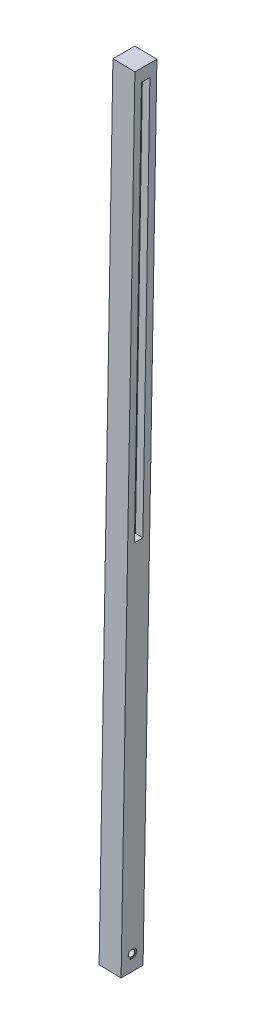
ISO-10303-21;
HEADER;
FILE_DESCRIPTION(('STEP AP214'),'2;1');
FILE_NAME('part.step','',(''),(''),'','','');
FILE_SCHEMA(('AUTOMOTIVE_DESIGN { 1 0 10303 214 1 1 1 1 }'));
ENDSEC;
DATA;
#1=APPLICATION_CONTEXT('core data for automotive mechanical design processes');
#2=APPLICATION_PROTOCOL_DEFINITION('international standard','automotive_design',2000,#1);
#3=PRODUCT_CONTEXT('',#1,'mechanical');
#4=PRODUCT('Part','Part','',(#3));
#5=PRODUCT_RELATED_PRODUCT_CATEGORY('part','',(#4));
#6=PRODUCT_DEFINITION_FORMATION('','',#4);
#7=PRODUCT_DEFINITION_CONTEXT('part definition',#1,'design');
#8=PRODUCT_DEFINITION('design','',#6,#7);
#9=PRODUCT_DEFINITION_SHAPE('','',#8);
#10=(LENGTH_UNIT() NAMED_UNIT(*) SI_UNIT(.MILLI.,.METRE.));
#11=(NAMED_UNIT(*) PLANE_ANGLE_UNIT() SI_UNIT($,.RADIAN.));
#12=(NAMED_UNIT(*) SI_UNIT($,.STERADIAN.) SOLID_ANGLE_UNIT());
#13=UNCERTAINTY_MEASURE_WITH_UNIT(LENGTH_MEASURE(1.E-05),#10,'distance_accuracy_value','');
#14=(GEOMETRIC_REPRESENTATION_CONTEXT(3) GLOBAL_UNCERTAINTY_ASSIGNED_CONTEXT((#13)) GLOBAL_UNIT_ASSIGNED_CONTEXT((#10,
#11,#12)) REPRESENTATION_CONTEXT('',''));
#15=CARTESIAN_POINT('',(0.,0.,0.));
#16=DIRECTION('',(0.,0.,1.));
#17=DIRECTION('',(1.,0.,0.));
#18=AXIS2_PLACEMENT_3D('',#15,#16,#17);
#19=CARTESIAN_POINT('',(50.6893476330801,30.8700505612896,0.));
#20=DIRECTION('',(-0.999847695156391,0.0174524064372842,0.));
#21=DIRECTION('',(-0.0174524064372842,-0.999847695156391,0.));
#22=AXIS2_PLACEMENT_3D('',#19,#20,#21);
#23=CYLINDRICAL_SURFACE('',#22,6.4135);
#24=CARTESIAN_POINT('',(-20.0802429044063,32.1053383590649,0.));
#25=DIRECTION('',(-0.999847695156391,0.0174524064372834,0.));
#26=DIRECTION('',(-0.0174524064372834,-0.999847695156391,0.));
#27=AXIS2_PLACEMENT_3D('',#24,#25,#26);
#28=CIRCLE('',#27,6.4135);
#29=CARTESIAN_POINT('',(-20.1921739130918,25.6928151661793,0.));
#30=VERTEX_POINT('',#29);
#31=EDGE_CURVE('E165',#30,#30,#28,.T.);
#32=ORIENTED_EDGE('',*,*,#31,.T.);
#33=EDGE_LOOP('',(#32));
#34=FACE_BOUND('',#33,.T.);
#35=CARTESIAN_POINT('',(21.1884707131738,31.384990283366,0.));
#36=DIRECTION('',(0.999847695156391,-0.0174524064372834,0.));
#37=DIRECTION('',(0.0174524064372834,0.999847695156391,0.));
#38=AXIS2_PLACEMENT_3D('',#35,#36,#37);
#39=CIRCLE('',#38,6.4135);
#40=CARTESIAN_POINT('',(21.3004017218593,37.7975134762515,0.));
#41=VERTEX_POINT('',#40);
#42=EDGE_CURVE('E43',#41,#41,#39,.T.);
#43=ORIENTED_EDGE('',*,*,#42,.T.);
#44=EDGE_LOOP('',(#43));
#45=FACE_BOUND('',#44,.T.);
#46=ADVANCED_FACE('F39',(#34,#45),#23,.F.);
#47=CARTESIAN_POINT('',(22.2216150248508,-0.38787973306853,22.225));
#48=DIRECTION('',(-0.999847695156391,0.0174524064372834,0.));
#49=DIRECTION('',(-0.0174524064372834,-0.999847695156391,0.));
#50=AXIS2_PLACEMENT_3D('',#47,#48,#49);
#51=PLANE('',#50);
#52=CARTESIAN_POINT('',(22.7757289292345,31.3572845881468,0.));
#53=DIRECTION('',(-0.999847695156391,0.0174524064372834,0.));
#54=DIRECTION('',(-0.0174524064372834,-0.999847695156391,0.));
#55=AXIS2_PLACEMENT_3D('',#52,#53,#54);
#56=CIRCLE('',#55,8.89);
#57=CARTESIAN_POINT('',(22.6205770360071,22.4686385782065,0.));
#58=VERTEX_POINT('',#57);
#59=EDGE_CURVE('E177',#58,#58,#56,.T.);
#60=ORIENTED_EDGE('',*,*,#59,.T.);
#61=EDGE_LOOP('',(#60));
#62=FACE_BOUND('',#61,.T.);
#63=DIRECTION('',(0.0174524064372834,0.999847695156391,0.));
#64=VECTOR('',#63,1.);
#65=CARTESIAN_POINT('',(35.5151313545394,761.197160732669,-8.4963));
#66=LINE('',#65,#64);
#67=CARTESIAN_POINT('',(35.5151313545394,761.197160732669,-8.4963));
#68=VERTEX_POINT('',#67);
#69=CARTESIAN_POINT('',(49.7004473067634,1573.87336735578,-8.4963));
#70=VERTEX_POINT('',#69);
#71=EDGE_CURVE('E57',#68,#70,#66,.T.);
#72=ORIENTED_EDGE('',*,*,#71,.F.);
#73=DIRECTION('',(0.,0.,1.));
#74=VECTOR('',#73,1.);
#75=CARTESIAN_POINT('',(35.5151313545394,761.197160732669,8.4963));
#76=LINE('',#75,#74);
#77=CARTESIAN_POINT('',(35.5151313545394,761.197160732669,8.4963));
#78=VERTEX_POINT('',#77);
#79=EDGE_CURVE('E182',#68,#78,#76,.T.);
#80=ORIENTED_EDGE('',*,*,#79,.T.);
#81=DIRECTION('',(0.0174524064372834,0.999847695156391,0.));
#82=VECTOR('',#81,1.);
#83=CARTESIAN_POINT('',(35.5151313545394,761.197160732669,8.4963));
#84=LINE('',#83,#82);
#85=CARTESIAN_POINT('',(49.7004473067633,1573.87336735578,8.4963));
#86=VERTEX_POINT('',#85);
#87=EDGE_CURVE('E134',#78,#86,#84,.T.);
#88=ORIENTED_EDGE('',*,*,#87,.T.);
#89=DIRECTION('',(0.,0.,1.));
#90=VECTOR('',#89,1.);
#91=CARTESIAN_POINT('',(49.7004473067633,1573.87336735578,8.4963));
#92=LINE('',#91,#90);
#93=EDGE_CURVE('E138',#70,#86,#92,.T.);
#94=ORIENTED_EDGE('',*,*,#93,.F.);
#95=EDGE_LOOP('',(#72,#80,#88,#94));
#96=FACE_BOUND('',#95,.T.);
#97=DIRECTION('',(0.,0.,1.));
#98=VECTOR('',#97,1.);
#99=CARTESIAN_POINT('',(50.1437384302704,1599.26949881276,22.225));
#100=LINE('',#99,#98);
#101=CARTESIAN_POINT('',(50.1437384302704,1599.26949881276,-22.225));
#102=VERTEX_POINT('',#101);
#103=CARTESIAN_POINT('',(50.1437384302704,1599.26949881276,22.225));
#104=VERTEX_POINT('',#103);
#105=EDGE_CURVE('E137',#102,#104,#100,.T.);
#106=ORIENTED_EDGE('',*,*,#105,.T.);
#107=DIRECTION('',(0.0174524064372834,0.999847695156391,0.));
#108=VECTOR('',#107,1.);
#109=CARTESIAN_POINT('',(22.2216150248508,-0.38787973306853,22.225));
#110=LINE('',#109,#108);
#111=CARTESIAN_POINT('',(22.2216150248508,-0.38787973306853,22.225));
#112=VERTEX_POINT('',#111);
#113=EDGE_CURVE('E11',#112,#104,#110,.T.);
#114=ORIENTED_EDGE('',*,*,#113,.F.);
#115=DIRECTION('',(0.,0.,1.));
#116=VECTOR('',#115,1.);
#117=CARTESIAN_POINT('',(22.2216150248508,-0.38787973306853,22.225));
#118=LINE('',#117,#116);
#119=CARTESIAN_POINT('',(22.2216150248508,-0.38787973306853,-22.225));
#120=VERTEX_POINT('',#119);
#121=EDGE_CURVE('E146',#120,#112,#118,.T.);
#122=ORIENTED_EDGE('',*,*,#121,.F.);
#123=DIRECTION('',(0.0174524064372834,0.999847695156391,0.));
#124=VECTOR('',#123,1.);
#125=CARTESIAN_POINT('',(22.2216150248508,-0.38787973306853,-22.225));
#126=LINE('',#125,#124);
#127=EDGE_CURVE('E152',#120,#102,#126,.T.);
#128=ORIENTED_EDGE('',*,*,#127,.T.);
#129=EDGE_LOOP('',(#106,#114,#122,#128));
#130=FACE_BOUND('',#129,.T.);
#131=ADVANCED_FACE('F41',(#62,#96,#130),#51,.F.);
#132=CARTESIAN_POINT('',(-22.2216150248508,0.38787973306853,22.225));
#133=DIRECTION('',(0.,0.,-1.));
#134=DIRECTION('',(-1.,0.,0.));
#135=AXIS2_PLACEMENT_3D('',#132,#133,#134);
#136=PLANE('',#135);
#137=DIRECTION('',(-0.999847695156391,0.0174524064372792,0.));
#138=VECTOR('',#137,1.);
#139=CARTESIAN_POINT('',(5.70050838056877,1600.04525827889,22.225));
#140=LINE('',#139,#138);
#141=CARTESIAN_POINT('',(5.70050838056877,1600.04525827889,22.225));
#142=VERTEX_POINT('',#141);
#143=EDGE_CURVE('E144',#104,#142,#140,.T.);
#144=ORIENTED_EDGE('',*,*,#143,.T.);
#145=DIRECTION('',(0.0174524064372834,0.999847695156391,0.));
#146=VECTOR('',#145,1.);
#147=CARTESIAN_POINT('',(-22.2216150248508,0.38787973306853,22.225));
#148=LINE('',#147,#146);
#149=CARTESIAN_POINT('',(-22.2216150248508,0.38787973306853,22.225));
#150=VERTEX_POINT('',#149);
#151=EDGE_CURVE('E48',#150,#142,#148,.T.);
#152=ORIENTED_EDGE('',*,*,#151,.F.);
#153=DIRECTION('',(-0.999847695156391,0.0174524064372792,0.));
#154=VECTOR('',#153,1.);
#155=CARTESIAN_POINT('',(-22.2216150248508,0.38787973306853,22.225));
#156=LINE('',#155,#154);
#157=EDGE_CURVE('E91',#112,#150,#156,.T.);
#158=ORIENTED_EDGE('',*,*,#157,.F.);
#159=ORIENTED_EDGE('',*,*,#113,.T.);
#160=EDGE_LOOP('',(#144,#152,#158,#159));
#161=FACE_BOUND('',#160,.T.);
#162=ADVANCED_FACE('F208',(#161),#136,.F.);
#163=CARTESIAN_POINT('',(-22.2216150248508,0.38787973306853,22.225));
#164=DIRECTION('',(0.999847695156391,-0.0174524064372834,0.));
#165=DIRECTION('',(0.0174524064372834,0.999847695156391,0.));
#166=AXIS2_PLACEMENT_3D('',#163,#164,#165);
#167=PLANE('',#166);
#168=CARTESIAN_POINT('',(-21.667501120467,32.133044054284,0.));
#169=DIRECTION('',(-0.999847695156391,0.0174524064372834,0.));
#170=DIRECTION('',(-0.0174524064372834,-0.999847695156391,0.));
#171=AXIS2_PLACEMENT_3D('',#168,#169,#170);
#172=CIRCLE('',#171,8.89);
#173=CARTESIAN_POINT('',(-21.8226530136945,23.2443980443437,0.));
#174=VERTEX_POINT('',#173);
#175=EDGE_CURVE('E175',#174,#174,#172,.T.);
#176=ORIENTED_EDGE('',*,*,#175,.F.);
#177=EDGE_LOOP('',(#176));
#178=FACE_BOUND('',#177,.T.);
#179=DIRECTION('',(0.,0.,-1.));
#180=VECTOR('',#179,1.);
#181=CARTESIAN_POINT('',(5.70050838056877,1600.04525827889,22.225));
#182=LINE('',#181,#180);
#183=CARTESIAN_POINT('',(5.70050838056877,1600.04525827889,-22.225));
#184=VERTEX_POINT('',#183);
#185=EDGE_CURVE('E160',#142,#184,#182,.T.);
#186=ORIENTED_EDGE('',*,*,#185,.T.);
#187=DIRECTION('',(0.0174524064372834,0.999847695156391,0.));
#188=VECTOR('',#187,1.);
#189=CARTESIAN_POINT('',(-22.2216150248508,0.38787973306853,-22.225));
#190=LINE('',#189,#188);
#191=CARTESIAN_POINT('',(-22.2216150248508,0.38787973306853,-22.225));
#192=VERTEX_POINT('',#191);
#193=EDGE_CURVE('E163',#192,#184,#190,.T.);
#194=ORIENTED_EDGE('',*,*,#193,.F.);
#195=DIRECTION('',(0.,0.,-1.));
#196=VECTOR('',#195,1.);
#197=CARTESIAN_POINT('',(-22.2216150248508,0.38787973306853,22.225));
#198=LINE('',#197,#196);
#199=EDGE_CURVE('E155',#150,#192,#198,.T.);
#200=ORIENTED_EDGE('',*,*,#199,.F.);
#201=ORIENTED_EDGE('',*,*,#151,.T.);
#202=EDGE_LOOP('',(#186,#194,#200,#201));
#203=FACE_BOUND('',#202,.T.);
#204=ADVANCED_FACE('F229',(#178,#203),#167,.F.);
#205=CARTESIAN_POINT('',(-22.2216150248508,0.38787973306853,-22.225));
#206=DIRECTION('',(0.,0.,1.));
#207=DIRECTION('',(1.,0.,0.));
#208=AXIS2_PLACEMENT_3D('',#205,#206,#207);
#209=PLANE('',#208);
#210=DIRECTION('',(0.999847695156391,-0.0174524064372792,0.));
#211=VECTOR('',#210,1.);
#212=CARTESIAN_POINT('',(5.70050838056877,1600.04525827889,-22.225));
#213=LINE('',#212,#211);
#214=EDGE_CURVE('E88',#184,#102,#213,.T.);
#215=ORIENTED_EDGE('',*,*,#214,.T.);
#216=ORIENTED_EDGE('',*,*,#127,.F.);
#217=DIRECTION('',(0.999847695156391,-0.0174524064372792,0.));
#218=VECTOR('',#217,1.);
#219=CARTESIAN_POINT('',(-22.2216150248508,0.38787973306853,-22.225));
#220=LINE('',#219,#218);
#221=EDGE_CURVE('E63',#192,#120,#220,.T.);
#222=ORIENTED_EDGE('',*,*,#221,.F.);
#223=ORIENTED_EDGE('',*,*,#193,.T.);
#224=EDGE_LOOP('',(#215,#216,#222,#223));
#225=FACE_BOUND('',#224,.T.);
#226=ADVANCED_FACE('F235',(#225),#209,.F.);
#227=CARTESIAN_POINT('',(-6.73419653374197E-12,6.66133814775094E-13,0.));
#228=DIRECTION('',(-0.0174524064372792,-0.999847695156391,0.));
#229=DIRECTION('',(0.999847695156391,-0.0174524064372792,0.));
#230=AXIS2_PLACEMENT_3D('',#227,#228,#229);
#231=PLANE('',#230);
#232=ORIENTED_EDGE('',*,*,#121,.T.);
#233=ORIENTED_EDGE('',*,*,#157,.T.);
#234=ORIENTED_EDGE('',*,*,#199,.T.);
#235=ORIENTED_EDGE('',*,*,#221,.T.);
#236=EDGE_LOOP('',(#232,#233,#234,#235));
#237=FACE_BOUND('',#236,.T.);
#238=ADVANCED_FACE('F245',(#237),#231,.T.);
#239=CARTESIAN_POINT('',(27.9221234054128,1599.65737854583,0.));
#240=DIRECTION('',(-0.0174524064372792,-0.999847695156391,0.));
#241=DIRECTION('',(0.999847695156391,-0.0174524064372792,0.));
#242=AXIS2_PLACEMENT_3D('',#239,#240,#241);
#243=PLANE('',#242);
#244=ORIENTED_EDGE('',*,*,#105,.F.);
#245=ORIENTED_EDGE('',*,*,#214,.F.);
#246=ORIENTED_EDGE('',*,*,#185,.F.);
#247=ORIENTED_EDGE('',*,*,#143,.F.);
#248=EDGE_LOOP('',(#244,#245,#246,#247));
#249=FACE_BOUND('',#248,.T.);
#250=ADVANCED_FACE('F237',(#249),#243,.F.);
#251=CARTESIAN_POINT('',(35.5151313545394,761.197160732669,8.4963));
#252=DIRECTION('',(0.,0.,-1.));
#253=DIRECTION('',(-1.,0.,0.));
#254=AXIS2_PLACEMENT_3D('',#251,#252,#253);
#255=PLANE('',#254);
#256=DIRECTION('',(-0.999847695156392,0.0174524064372705,0.));
#257=VECTOR('',#256,1.);
#258=CARTESIAN_POINT('',(49.7004473067633,1573.87336735578,8.4963));
#259=LINE('',#258,#257);
#260=CARTESIAN_POINT('',(34.6913336156927,1574.13535240978,8.4963));
#261=VERTEX_POINT('',#260);
#262=EDGE_CURVE('E168',#86,#261,#259,.T.);
#263=ORIENTED_EDGE('',*,*,#262,.F.);
#264=ORIENTED_EDGE('',*,*,#87,.F.);
#265=DIRECTION('',(-0.999847695156392,0.0174524064372705,0.));
#266=VECTOR('',#265,1.);
#267=CARTESIAN_POINT('',(35.5151313545394,761.197160732669,8.4963));
#268=LINE('',#267,#266);
#269=CARTESIAN_POINT('',(20.5060176634687,761.459145786662,8.4963));
#270=VERTEX_POINT('',#269);
#271=EDGE_CURVE('E119',#78,#270,#268,.T.);
#272=ORIENTED_EDGE('',*,*,#271,.T.);
#273=DIRECTION('',(0.0174524064372834,0.999847695156391,0.));
#274=VECTOR('',#273,1.);
#275=CARTESIAN_POINT('',(20.5060176634687,761.459145786662,8.4963));
#276=LINE('',#275,#274);
#277=EDGE_CURVE('E135',#270,#261,#276,.T.);
#278=ORIENTED_EDGE('',*,*,#277,.T.);
#279=EDGE_LOOP('',(#263,#264,#272,#278));
#280=FACE_BOUND('',#279,.T.);
#281=ADVANCED_FACE('F133',(#280),#255,.T.);
#282=CARTESIAN_POINT('',(20.5060176634687,761.459145786662,8.4963));
#283=DIRECTION('',(0.999847695156391,-0.0174524064372834,0.));
#284=DIRECTION('',(0.0174524064372834,0.999847695156391,0.));
#285=AXIS2_PLACEMENT_3D('',#282,#283,#284);
#286=PLANE('',#285);
#287=DIRECTION('',(0.,0.,-1.));
#288=VECTOR('',#287,1.);
#289=CARTESIAN_POINT('',(34.6913336156927,1574.13535240978,8.4963));
#290=LINE('',#289,#288);
#291=CARTESIAN_POINT('',(34.6913336156927,1574.13535240978,-8.4963));
#292=VERTEX_POINT('',#291);
#293=EDGE_CURVE('E139',#261,#292,#290,.T.);
#294=ORIENTED_EDGE('',*,*,#293,.F.);
#295=ORIENTED_EDGE('',*,*,#277,.F.);
#296=DIRECTION('',(0.,0.,-1.));
#297=VECTOR('',#296,1.);
#298=CARTESIAN_POINT('',(20.5060176634687,761.459145786662,8.4963));
#299=LINE('',#298,#297);
#300=CARTESIAN_POINT('',(20.5060176634687,761.459145786662,-8.4963));
#301=VERTEX_POINT('',#300);
#302=EDGE_CURVE('E116',#270,#301,#299,.T.);
#303=ORIENTED_EDGE('',*,*,#302,.T.);
#304=DIRECTION('',(0.0174524064372834,0.999847695156391,0.));
#305=VECTOR('',#304,1.);
#306=CARTESIAN_POINT('',(20.5060176634687,761.459145786662,-8.4963));
#307=LINE('',#306,#305);
#308=EDGE_CURVE('E142',#301,#292,#307,.T.);
#309=ORIENTED_EDGE('',*,*,#308,.T.);
#310=EDGE_LOOP('',(#294,#295,#303,#309));
#311=FACE_BOUND('',#310,.T.);
#312=ADVANCED_FACE('F136',(#311),#286,.T.);
#313=CARTESIAN_POINT('',(35.5151313545394,761.197160732669,-8.4963));
#314=DIRECTION('',(0.,0.,1.));
#315=DIRECTION('',(1.,0.,0.));
#316=AXIS2_PLACEMENT_3D('',#313,#314,#315);
#317=PLANE('',#316);
#318=DIRECTION('',(0.999847695156392,-0.0174524064372705,0.));
#319=VECTOR('',#318,1.);
#320=CARTESIAN_POINT('',(49.7004473067633,1573.87336735578,-8.4963));
#321=LINE('',#320,#319);
#322=EDGE_CURVE('E187',#292,#70,#321,.T.);
#323=ORIENTED_EDGE('',*,*,#322,.F.);
#324=ORIENTED_EDGE('',*,*,#308,.F.);
#325=DIRECTION('',(0.999847695156392,-0.0174524064372705,0.));
#326=VECTOR('',#325,1.);
#327=CARTESIAN_POINT('',(35.5151313545394,761.197160732669,-8.4963));
#328=LINE('',#327,#326);
#329=EDGE_CURVE('E125',#301,#68,#328,.T.);
#330=ORIENTED_EDGE('',*,*,#329,.T.);
#331=ORIENTED_EDGE('',*,*,#71,.T.);
#332=EDGE_LOOP('',(#323,#324,#330,#331));
#333=FACE_BOUND('',#332,.T.);
#334=ADVANCED_FACE('F191',(#333),#317,.T.);
#335=CARTESIAN_POINT('',(13.2935163296679,761.585040465738,0.));
#336=DIRECTION('',(-0.0174524064372705,-0.999847695156392,0.));
#337=DIRECTION('',(0.999847695156392,-0.0174524064372705,0.));
#338=AXIS2_PLACEMENT_3D('',#335,#336,#337);
#339=PLANE('',#338);
#340=ORIENTED_EDGE('',*,*,#271,.F.);
#341=ORIENTED_EDGE('',*,*,#79,.F.);
#342=ORIENTED_EDGE('',*,*,#329,.F.);
#343=ORIENTED_EDGE('',*,*,#302,.F.);
#344=EDGE_LOOP('',(#340,#341,#342,#343));
#345=FACE_BOUND('',#344,.T.);
#346=ADVANCED_FACE('F117',(#345),#339,.F.);
#347=CARTESIAN_POINT('',(27.4788322818918,1574.26124708885,0.));
#348=DIRECTION('',(-0.0174524064372705,-0.999847695156392,0.));
#349=DIRECTION('',(0.999847695156392,-0.0174524064372705,0.));
#350=AXIS2_PLACEMENT_3D('',#347,#348,#349);
#351=PLANE('',#350);
#352=ORIENTED_EDGE('',*,*,#262,.T.);
#353=ORIENTED_EDGE('',*,*,#293,.T.);
#354=ORIENTED_EDGE('',*,*,#322,.T.);
#355=ORIENTED_EDGE('',*,*,#93,.T.);
#356=EDGE_LOOP('',(#352,#353,#354,#355));
#357=FACE_BOUND('',#356,.T.);
#358=ADVANCED_FACE('F194',(#357),#351,.T.);
#359=CARTESIAN_POINT('',(-20.0802429044063,32.1053383590648,0.));
#360=DIRECTION('',(-0.999847695156391,0.0174524064372834,0.));
#361=DIRECTION('',(-0.0174524064372834,-0.999847695156391,0.));
#362=AXIS2_PLACEMENT_3D('',#359,#360,#361);
#363=CYLINDRICAL_SURFACE('',#362,8.89);
#364=CARTESIAN_POINT('',(-20.0802429044063,32.1053383590648,0.));
#365=DIRECTION('',(-0.999847695156391,0.0174524064372834,0.));
#366=DIRECTION('',(-0.0174524064372834,-0.999847695156391,0.));
#367=AXIS2_PLACEMENT_3D('',#364,#365,#366);
#368=CIRCLE('',#367,8.89);
#369=CARTESIAN_POINT('',(-20.2353947976337,23.2166923491245,0.));
#370=VERTEX_POINT('',#369);
#371=EDGE_CURVE('E170',#370,#370,#368,.T.);
#372=ORIENTED_EDGE('',*,*,#371,.F.);
#373=EDGE_LOOP('',(#372));
#374=FACE_BOUND('',#373,.T.);
#375=ORIENTED_EDGE('',*,*,#175,.T.);
#376=EDGE_LOOP('',(#375));
#377=FACE_BOUND('',#376,.T.);
#378=ADVANCED_FACE('F211',(#374,#377),#363,.F.);
#379=CARTESIAN_POINT('',(-20.0802429044063,32.1053383590648,0.));
#380=DIRECTION('',(-0.999847695156391,0.0174524064372834,0.));
#381=DIRECTION('',(-0.0174524064372834,-0.999847695156391,0.));
#382=AXIS2_PLACEMENT_3D('',#379,#380,#381);
#383=PLANE('',#382);
#384=ORIENTED_EDGE('',*,*,#31,.F.);
#385=EDGE_LOOP('',(#384));
#386=FACE_BOUND('',#385,.T.);
#387=ORIENTED_EDGE('',*,*,#371,.T.);
#388=EDGE_LOOP('',(#387));
#389=FACE_BOUND('',#388,.T.);
#390=ADVANCED_FACE('F223',(#386,#389),#383,.T.);
#391=CARTESIAN_POINT('',(21.1884707131738,31.384990283366,0.));
#392=DIRECTION('',(0.999847695156391,-0.0174524064372834,0.));
#393=DIRECTION('',(0.0174524064372834,0.999847695156391,0.));
#394=AXIS2_PLACEMENT_3D('',#391,#392,#393);
#395=CYLINDRICAL_SURFACE('',#394,8.89);
#396=CARTESIAN_POINT('',(21.1884707131738,31.384990283366,0.));
#397=DIRECTION('',(-0.999847695156391,0.0174524064372834,0.));
#398=DIRECTION('',(-0.0174524064372834,-0.999847695156391,0.));
#399=AXIS2_PLACEMENT_3D('',#396,#397,#398);
#400=CIRCLE('',#399,8.89);
#401=CARTESIAN_POINT('',(21.0333188199463,22.4963442734256,0.));
#402=VERTEX_POINT('',#401);
#403=EDGE_CURVE('E316',#402,#402,#400,.T.);
#404=ORIENTED_EDGE('',*,*,#403,.T.);
#405=EDGE_LOOP('',(#404));
#406=FACE_BOUND('',#405,.T.);
#407=ORIENTED_EDGE('',*,*,#59,.F.);
#408=EDGE_LOOP('',(#407));
#409=FACE_BOUND('',#408,.T.);
#410=ADVANCED_FACE('F222',(#406,#409),#395,.F.);
#411=CARTESIAN_POINT('',(21.1884707131738,31.384990283366,0.));
#412=DIRECTION('',(0.999847695156391,-0.0174524064372834,0.));
#413=DIRECTION('',(-0.0174524064372834,-0.999847695156391,0.));
#414=AXIS2_PLACEMENT_3D('',#411,#412,#413);
#415=PLANE('',#414);
#416=ORIENTED_EDGE('',*,*,#42,.F.);
#417=EDGE_LOOP('',(#416));
#418=FACE_BOUND('',#417,.T.);
#419=ORIENTED_EDGE('',*,*,#403,.F.);
#420=EDGE_LOOP('',(#419));
#421=FACE_BOUND('',#420,.T.);
#422=ADVANCED_FACE('F301',(#418,#421),#415,.T.);
#423=CLOSED_SHELL('',(#46,#131,#162,#204,#226,#238,#250,#281,#312,#334,#346,#358,#378,#390,#410,#422));
#424=MANIFOLD_SOLID_BREP('B2',#423);
#425=ADVANCED_BREP_SHAPE_REPRESENTATION('',(#18,#424),#14);
#426=SHAPE_DEFINITION_REPRESENTATION(#9,#425);
ENDSEC;
END-ISO-10303-21;
